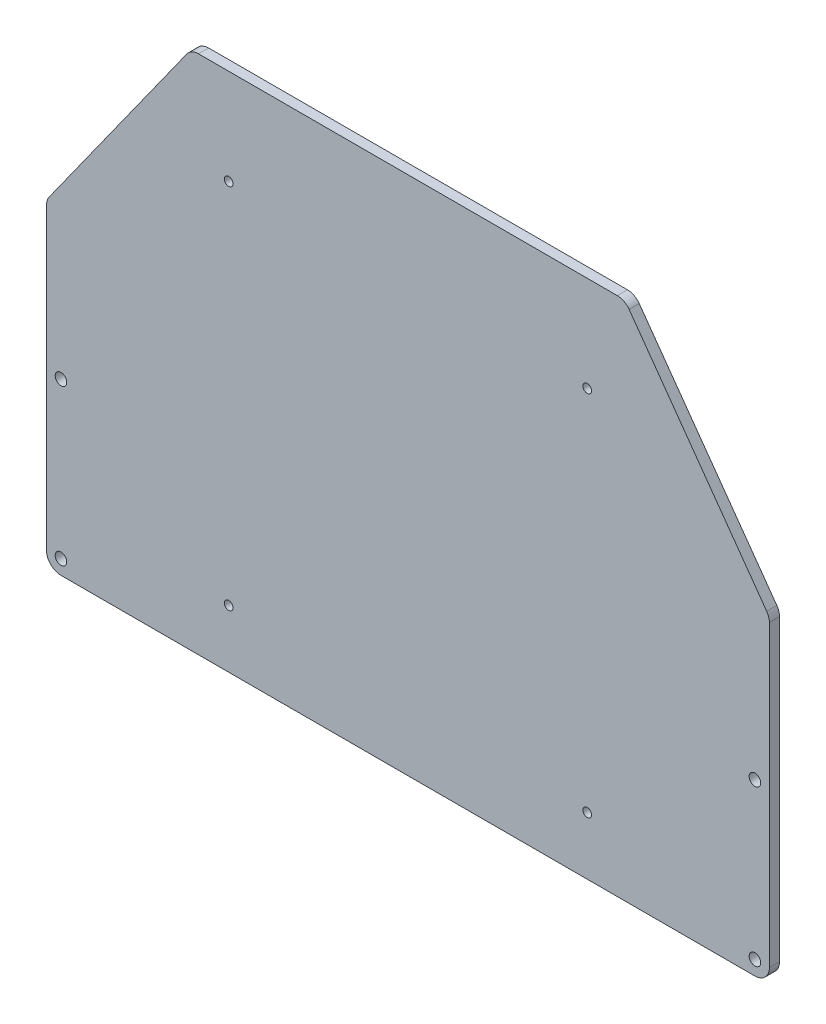
ISO-10303-21;
HEADER;
FILE_DESCRIPTION(('STEP AP214'),'2;1');
FILE_NAME('part.step','',(''),(''),'','','');
FILE_SCHEMA(('AUTOMOTIVE_DESIGN { 1 0 10303 214 1 1 1 1 }'));
ENDSEC;
DATA;
#1=APPLICATION_CONTEXT('core data for automotive mechanical design processes');
#2=APPLICATION_PROTOCOL_DEFINITION('international standard','automotive_design',2000,#1);
#3=PRODUCT_CONTEXT('',#1,'mechanical');
#4=PRODUCT('Part','Part','',(#3));
#5=PRODUCT_RELATED_PRODUCT_CATEGORY('part','',(#4));
#6=PRODUCT_DEFINITION_FORMATION('','',#4);
#7=PRODUCT_DEFINITION_CONTEXT('part definition',#1,'design');
#8=PRODUCT_DEFINITION('design','',#6,#7);
#9=PRODUCT_DEFINITION_SHAPE('','',#8);
#10=(LENGTH_UNIT() NAMED_UNIT(*) SI_UNIT(.MILLI.,.METRE.));
#11=(NAMED_UNIT(*) PLANE_ANGLE_UNIT() SI_UNIT($,.RADIAN.));
#12=(NAMED_UNIT(*) SI_UNIT($,.STERADIAN.) SOLID_ANGLE_UNIT());
#13=UNCERTAINTY_MEASURE_WITH_UNIT(LENGTH_MEASURE(1.E-05),#10,'distance_accuracy_value','');
#14=(GEOMETRIC_REPRESENTATION_CONTEXT(3) GLOBAL_UNCERTAINTY_ASSIGNED_CONTEXT((#13)) GLOBAL_UNIT_ASSIGNED_CONTEXT((#10,
#11,#12)) REPRESENTATION_CONTEXT('',''));
#15=CARTESIAN_POINT('',(0.,0.,0.));
#16=DIRECTION('',(0.,0.,1.));
#17=DIRECTION('',(1.,0.,0.));
#18=AXIS2_PLACEMENT_3D('',#15,#16,#17);
#19=CARTESIAN_POINT('',(250.,5.,3.5));
#20=DIRECTION('',(-1.,0.,0.));
#21=DIRECTION('',(0.,0.,1.));
#22=AXIS2_PLACEMENT_3D('',#19,#20,#21);
#23=PLANE('',#22);
#24=DIRECTION('',(0.,1.,0.));
#25=VECTOR('',#24,1.);
#26=CARTESIAN_POINT('',(250.,5.,0.));
#27=LINE('',#26,#25);
#28=CARTESIAN_POINT('',(250.,5.,0.));
#29=VERTEX_POINT('',#28);
#30=CARTESIAN_POINT('',(250.,108.397674732957,0.));
#31=VERTEX_POINT('',#30);
#32=EDGE_CURVE('E223',#29,#31,#27,.T.);
#33=ORIENTED_EDGE('',*,*,#32,.T.);
#34=DIRECTION('',(0.,0.,-1.));
#35=VECTOR('',#34,1.);
#36=CARTESIAN_POINT('',(250.,108.397674732957,3.5));
#37=LINE('',#36,#35);
#38=CARTESIAN_POINT('',(250.,108.397674732957,3.5));
#39=VERTEX_POINT('',#38);
#40=EDGE_CURVE('E177',#31,#39,#37,.F.);
#41=ORIENTED_EDGE('',*,*,#40,.T.);
#42=DIRECTION('',(0.,1.,0.));
#43=VECTOR('',#42,1.);
#44=CARTESIAN_POINT('',(250.,5.,3.5));
#45=LINE('',#44,#43);
#46=CARTESIAN_POINT('',(250.,5.,3.5));
#47=VERTEX_POINT('',#46);
#48=EDGE_CURVE('E211',#47,#39,#45,.T.);
#49=ORIENTED_EDGE('',*,*,#48,.F.);
#50=DIRECTION('',(0.,0.,-1.));
#51=VECTOR('',#50,1.);
#52=CARTESIAN_POINT('',(250.,5.,3.5));
#53=LINE('',#52,#51);
#54=EDGE_CURVE('E155',#47,#29,#53,.T.);
#55=ORIENTED_EDGE('',*,*,#54,.T.);
#56=EDGE_LOOP('',(#33,#41,#49,#55));
#57=FACE_BOUND('',#56,.T.);
#58=ADVANCED_FACE('F34',(#57),#23,.F.);
#59=CARTESIAN_POINT('',(0.,5.00000000000004,3.5));
#60=DIRECTION('',(1.,0.,0.));
#61=DIRECTION('',(0.,0.,-1.));
#62=AXIS2_PLACEMENT_3D('',#59,#60,#61);
#63=PLANE('',#62);
#64=DIRECTION('',(0.,-1.,0.));
#65=VECTOR('',#64,1.);
#66=CARTESIAN_POINT('',(0.,5.00000000000004,3.5));
#67=LINE('',#66,#65);
#68=CARTESIAN_POINT('',(0.,108.397674732957,3.5));
#69=VERTEX_POINT('',#68);
#70=CARTESIAN_POINT('',(0.,5.00000000000004,3.5));
#71=VERTEX_POINT('',#70);
#72=EDGE_CURVE('E141',#69,#71,#67,.T.);
#73=ORIENTED_EDGE('',*,*,#72,.F.);
#74=DIRECTION('',(0.,0.,-1.));
#75=VECTOR('',#74,1.);
#76=CARTESIAN_POINT('',(0.,108.397674732957,0.));
#77=LINE('',#76,#75);
#78=CARTESIAN_POINT('',(0.,108.397674732957,0.));
#79=VERTEX_POINT('',#78);
#80=EDGE_CURVE('E11',#69,#79,#77,.T.);
#81=ORIENTED_EDGE('',*,*,#80,.T.);
#82=DIRECTION('',(0.,-1.,0.));
#83=VECTOR('',#82,1.);
#84=CARTESIAN_POINT('',(0.,5.00000000000004,0.));
#85=LINE('',#84,#83);
#86=CARTESIAN_POINT('',(0.,5.00000000000004,0.));
#87=VERTEX_POINT('',#86);
#88=EDGE_CURVE('E145',#79,#87,#85,.T.);
#89=ORIENTED_EDGE('',*,*,#88,.T.);
#90=DIRECTION('',(0.,0.,-1.));
#91=VECTOR('',#90,1.);
#92=CARTESIAN_POINT('',(0.,5.00000000000004,3.5));
#93=LINE('',#92,#91);
#94=EDGE_CURVE('E210',#71,#87,#93,.T.);
#95=ORIENTED_EDGE('',*,*,#94,.F.);
#96=EDGE_LOOP('',(#73,#81,#89,#95));
#97=FACE_BOUND('',#96,.T.);
#98=ADVANCED_FACE('F209',(#97),#63,.F.);
#99=CARTESIAN_POINT('',(5.,5.,3.5));
#100=DIRECTION('',(0.,0.,-1.));
#101=DIRECTION('',(-1.,0.,0.));
#102=AXIS2_PLACEMENT_3D('',#99,#100,#101);
#103=PLANE('',#102);
#104=CARTESIAN_POINT('',(187.,147.,3.5));
#105=DIRECTION('',(0.,0.,-1.));
#106=DIRECTION('',(-1.,0.,0.));
#107=AXIS2_PLACEMENT_3D('',#104,#105,#106);
#108=CIRCLE('',#107,1.5);
#109=CARTESIAN_POINT('',(185.5,147.,3.5));
#110=VERTEX_POINT('',#109);
#111=EDGE_CURVE('E339',#110,#110,#108,.T.);
#112=ORIENTED_EDGE('',*,*,#111,.T.);
#113=EDGE_LOOP('',(#112));
#114=FACE_BOUND('',#113,.T.);
#115=CARTESIAN_POINT('',(63.,147.,3.5));
#116=DIRECTION('',(0.,0.,-1.));
#117=DIRECTION('',(-1.,0.,0.));
#118=AXIS2_PLACEMENT_3D('',#115,#116,#117);
#119=CIRCLE('',#118,1.5);
#120=CARTESIAN_POINT('',(61.5,147.,3.5));
#121=VERTEX_POINT('',#120);
#122=EDGE_CURVE('E343',#121,#121,#119,.T.);
#123=ORIENTED_EDGE('',*,*,#122,.T.);
#124=EDGE_LOOP('',(#123));
#125=FACE_BOUND('',#124,.T.);
#126=CARTESIAN_POINT('',(63.,20.,3.5));
#127=DIRECTION('',(0.,0.,-1.));
#128=DIRECTION('',(-1.,0.,0.));
#129=AXIS2_PLACEMENT_3D('',#126,#127,#128);
#130=CIRCLE('',#129,1.5);
#131=CARTESIAN_POINT('',(61.5,20.,3.5));
#132=VERTEX_POINT('',#131);
#133=EDGE_CURVE('E352',#132,#132,#130,.T.);
#134=ORIENTED_EDGE('',*,*,#133,.T.);
#135=EDGE_LOOP('',(#134));
#136=FACE_BOUND('',#135,.T.);
#137=CARTESIAN_POINT('',(187.,20.,3.5));
#138=DIRECTION('',(0.,0.,-1.));
#139=DIRECTION('',(-1.,0.,0.));
#140=AXIS2_PLACEMENT_3D('',#137,#138,#139);
#141=CIRCLE('',#140,1.5);
#142=CARTESIAN_POINT('',(185.5,20.,3.5));
#143=VERTEX_POINT('',#142);
#144=EDGE_CURVE('E245',#143,#143,#141,.T.);
#145=ORIENTED_EDGE('',*,*,#144,.T.);
#146=EDGE_LOOP('',(#145));
#147=FACE_BOUND('',#146,.T.);
#148=CARTESIAN_POINT('',(5.,5.,3.5));
#149=DIRECTION('',(0.,0.,1.));
#150=DIRECTION('',(1.,0.,0.));
#151=AXIS2_PLACEMENT_3D('',#148,#149,#150);
#152=CIRCLE('',#151,2.);
#153=CARTESIAN_POINT('',(7.,5.,3.5));
#154=VERTEX_POINT('',#153);
#155=EDGE_CURVE('E258',#154,#154,#152,.T.);
#156=ORIENTED_EDGE('',*,*,#155,.F.);
#157=EDGE_LOOP('',(#156));
#158=FACE_BOUND('',#157,.T.);
#159=CARTESIAN_POINT('',(245.,58.8,3.5));
#160=DIRECTION('',(0.,0.,1.));
#161=DIRECTION('',(1.,0.,0.));
#162=AXIS2_PLACEMENT_3D('',#159,#160,#161);
#163=CIRCLE('',#162,2.);
#164=CARTESIAN_POINT('',(247.,58.8,3.5));
#165=VERTEX_POINT('',#164);
#166=EDGE_CURVE('E254',#165,#165,#163,.T.);
#167=ORIENTED_EDGE('',*,*,#166,.F.);
#168=EDGE_LOOP('',(#167));
#169=FACE_BOUND('',#168,.T.);
#170=CARTESIAN_POINT('',(5.,58.8,3.5));
#171=DIRECTION('',(0.,0.,1.));
#172=DIRECTION('',(1.,0.,0.));
#173=AXIS2_PLACEMENT_3D('',#170,#171,#172);
#174=CIRCLE('',#173,2.);
#175=CARTESIAN_POINT('',(7.,58.8,3.5));
#176=VERTEX_POINT('',#175);
#177=EDGE_CURVE('E265',#176,#176,#174,.T.);
#178=ORIENTED_EDGE('',*,*,#177,.F.);
#179=EDGE_LOOP('',(#178));
#180=FACE_BOUND('',#179,.T.);
#181=CARTESIAN_POINT('',(245.,5.,3.5));
#182=DIRECTION('',(0.,0.,1.));
#183=DIRECTION('',(1.,0.,0.));
#184=AXIS2_PLACEMENT_3D('',#181,#182,#183);
#185=CIRCLE('',#184,2.);
#186=CARTESIAN_POINT('',(247.,5.,3.5));
#187=VERTEX_POINT('',#186);
#188=EDGE_CURVE('E259',#187,#187,#185,.T.);
#189=ORIENTED_EDGE('',*,*,#188,.F.);
#190=EDGE_LOOP('',(#189));
#191=FACE_BOUND('',#190,.T.);
#192=ORIENTED_EDGE('',*,*,#48,.T.);
#193=CARTESIAN_POINT('',(245.,108.397674732957,3.5));
#194=DIRECTION('',(0.,0.,-1.));
#195=DIRECTION('',(-1.,0.,0.));
#196=AXIS2_PLACEMENT_3D('',#193,#194,#195);
#197=CIRCLE('',#196,5.);
#198=CARTESIAN_POINT('',(249.068667356034,111.303865701553,3.5));
#199=VERTEX_POINT('',#198);
#200=EDGE_CURVE('E184',#39,#199,#197,.F.);
#201=ORIENTED_EDGE('',*,*,#200,.T.);
#202=DIRECTION('',(0.581238193719096,-0.813733471206735,0.));
#203=VECTOR('',#202,1.);
#204=CARTESIAN_POINT('',(216.891891891892,156.351351351351,3.5));
#205=LINE('',#204,#203);
#206=CARTESIAN_POINT('',(201.495577879575,177.906190968595,3.5));
#207=VERTEX_POINT('',#206);
#208=EDGE_CURVE('E243',#207,#199,#205,.T.);
#209=ORIENTED_EDGE('',*,*,#208,.F.);
#210=CARTESIAN_POINT('',(197.426910523541,175.,3.5));
#211=DIRECTION('',(0.,0.,-1.));
#212=DIRECTION('',(-1.,0.,0.));
#213=AXIS2_PLACEMENT_3D('',#210,#211,#212);
#214=CIRCLE('',#213,5.);
#215=CARTESIAN_POINT('',(197.426910523541,180.,3.5));
#216=VERTEX_POINT('',#215);
#217=EDGE_CURVE('E49',#207,#216,#214,.F.);
#218=ORIENTED_EDGE('',*,*,#217,.T.);
#219=DIRECTION('',(1.,0.,0.));
#220=VECTOR('',#219,1.);
#221=CARTESIAN_POINT('',(5.,180.,3.5));
#222=LINE('',#221,#220);
#223=CARTESIAN_POINT('',(52.573089476459,180.,3.5));
#224=VERTEX_POINT('',#223);
#225=EDGE_CURVE('E244',#224,#216,#222,.T.);
#226=ORIENTED_EDGE('',*,*,#225,.F.);
#227=CARTESIAN_POINT('',(52.573089476459,175.,3.5));
#228=DIRECTION('',(0.,0.,-1.));
#229=DIRECTION('',(-1.,0.,0.));
#230=AXIS2_PLACEMENT_3D('',#227,#228,#229);
#231=CIRCLE('',#230,5.);
#232=CARTESIAN_POINT('',(48.5044221204253,177.906190968595,3.5));
#233=VERTEX_POINT('',#232);
#234=EDGE_CURVE('E181',#224,#233,#231,.F.);
#235=ORIENTED_EDGE('',*,*,#234,.T.);
#236=DIRECTION('',(0.581238193719096,0.813733471206735,0.));
#237=VECTOR('',#236,1.);
#238=CARTESIAN_POINT('',(-47.972972972973,42.8378378378378,3.5));
#239=LINE('',#238,#237);
#240=CARTESIAN_POINT('',(0.931332643966325,111.303865701553,3.5));
#241=VERTEX_POINT('',#240);
#242=EDGE_CURVE('E199',#241,#233,#239,.T.);
#243=ORIENTED_EDGE('',*,*,#242,.F.);
#244=CARTESIAN_POINT('',(5.,108.397674732957,3.5));
#245=DIRECTION('',(0.,0.,-1.));
#246=DIRECTION('',(-1.,0.,0.));
#247=AXIS2_PLACEMENT_3D('',#244,#245,#246);
#248=CIRCLE('',#247,5.);
#249=EDGE_CURVE('E179',#241,#69,#248,.F.);
#250=ORIENTED_EDGE('',*,*,#249,.T.);
#251=ORIENTED_EDGE('',*,*,#72,.T.);
#252=CARTESIAN_POINT('',(5.,5.,3.5));
#253=DIRECTION('',(0.,0.,1.));
#254=DIRECTION('',(-1.,0.,0.));
#255=AXIS2_PLACEMENT_3D('',#252,#253,#254);
#256=CIRCLE('',#255,5.);
#257=CARTESIAN_POINT('',(5.00000000000004,0.,3.5));
#258=VERTEX_POINT('',#257);
#259=EDGE_CURVE('E135',#71,#258,#256,.T.);
#260=ORIENTED_EDGE('',*,*,#259,.T.);
#261=DIRECTION('',(1.,0.,0.));
#262=VECTOR('',#261,1.);
#263=CARTESIAN_POINT('',(5.00000000000004,0.,3.5));
#264=LINE('',#263,#262);
#265=CARTESIAN_POINT('',(245.,0.,3.5));
#266=VERTEX_POINT('',#265);
#267=EDGE_CURVE('E125',#258,#266,#264,.T.);
#268=ORIENTED_EDGE('',*,*,#267,.T.);
#269=CARTESIAN_POINT('',(245.,5.,3.5));
#270=DIRECTION('',(0.,0.,1.));
#271=DIRECTION('',(-1.,0.,0.));
#272=AXIS2_PLACEMENT_3D('',#269,#270,#271);
#273=CIRCLE('',#272,5.);
#274=EDGE_CURVE('E134',#266,#47,#273,.T.);
#275=ORIENTED_EDGE('',*,*,#274,.T.);
#276=EDGE_LOOP('',(#192,#201,#209,#218,#226,#235,#243,#250,#251,#260,#268,#275));
#277=FACE_BOUND('',#276,.T.);
#278=ADVANCED_FACE('F139',(#114,#125,#136,#147,#158,#169,#180,#191,#277),#103,.F.);
#279=CARTESIAN_POINT('',(5.,5.,0.));
#280=DIRECTION('',(0.,0.,-1.));
#281=DIRECTION('',(-1.,0.,0.));
#282=AXIS2_PLACEMENT_3D('',#279,#280,#281);
#283=PLANE('',#282);
#284=CARTESIAN_POINT('',(187.,147.,0.));
#285=DIRECTION('',(0.,0.,-1.));
#286=DIRECTION('',(-1.,0.,0.));
#287=AXIS2_PLACEMENT_3D('',#284,#285,#286);
#288=CIRCLE('',#287,1.5);
#289=CARTESIAN_POINT('',(185.5,147.,0.));
#290=VERTEX_POINT('',#289);
#291=EDGE_CURVE('E342',#290,#290,#288,.T.);
#292=ORIENTED_EDGE('',*,*,#291,.F.);
#293=EDGE_LOOP('',(#292));
#294=FACE_BOUND('',#293,.T.);
#295=CARTESIAN_POINT('',(63.,147.,0.));
#296=DIRECTION('',(0.,0.,-1.));
#297=DIRECTION('',(-1.,0.,0.));
#298=AXIS2_PLACEMENT_3D('',#295,#296,#297);
#299=CIRCLE('',#298,1.5);
#300=CARTESIAN_POINT('',(61.5,147.,0.));
#301=VERTEX_POINT('',#300);
#302=EDGE_CURVE('E347',#301,#301,#299,.T.);
#303=ORIENTED_EDGE('',*,*,#302,.F.);
#304=EDGE_LOOP('',(#303));
#305=FACE_BOUND('',#304,.T.);
#306=CARTESIAN_POINT('',(63.,20.,0.));
#307=DIRECTION('',(0.,0.,-1.));
#308=DIRECTION('',(-1.,0.,0.));
#309=AXIS2_PLACEMENT_3D('',#306,#307,#308);
#310=CIRCLE('',#309,1.5);
#311=CARTESIAN_POINT('',(61.5,20.,0.));
#312=VERTEX_POINT('',#311);
#313=EDGE_CURVE('E355',#312,#312,#310,.T.);
#314=ORIENTED_EDGE('',*,*,#313,.F.);
#315=EDGE_LOOP('',(#314));
#316=FACE_BOUND('',#315,.T.);
#317=CARTESIAN_POINT('',(187.,20.,0.));
#318=DIRECTION('',(0.,0.,-1.));
#319=DIRECTION('',(-1.,0.,0.));
#320=AXIS2_PLACEMENT_3D('',#317,#318,#319);
#321=CIRCLE('',#320,1.5);
#322=CARTESIAN_POINT('',(185.5,20.,0.));
#323=VERTEX_POINT('',#322);
#324=EDGE_CURVE('E249',#323,#323,#321,.T.);
#325=ORIENTED_EDGE('',*,*,#324,.F.);
#326=EDGE_LOOP('',(#325));
#327=FACE_BOUND('',#326,.T.);
#328=CARTESIAN_POINT('',(245.,5.,0.));
#329=DIRECTION('',(0.,0.,1.));
#330=DIRECTION('',(1.,0.,0.));
#331=AXIS2_PLACEMENT_3D('',#328,#329,#330);
#332=CIRCLE('',#331,2.);
#333=CARTESIAN_POINT('',(247.,5.,0.));
#334=VERTEX_POINT('',#333);
#335=EDGE_CURVE('E255',#334,#334,#332,.T.);
#336=ORIENTED_EDGE('',*,*,#335,.T.);
#337=EDGE_LOOP('',(#336));
#338=FACE_BOUND('',#337,.T.);
#339=CARTESIAN_POINT('',(5.,58.8,0.));
#340=DIRECTION('',(0.,0.,1.));
#341=DIRECTION('',(1.,0.,0.));
#342=AXIS2_PLACEMENT_3D('',#339,#340,#341);
#343=CIRCLE('',#342,2.);
#344=CARTESIAN_POINT('',(7.,58.8,0.));
#345=VERTEX_POINT('',#344);
#346=EDGE_CURVE('E262',#345,#345,#343,.T.);
#347=ORIENTED_EDGE('',*,*,#346,.T.);
#348=EDGE_LOOP('',(#347));
#349=FACE_BOUND('',#348,.T.);
#350=CARTESIAN_POINT('',(245.,58.8,0.));
#351=DIRECTION('',(0.,0.,1.));
#352=DIRECTION('',(1.,0.,0.));
#353=AXIS2_PLACEMENT_3D('',#350,#351,#352);
#354=CIRCLE('',#353,2.);
#355=CARTESIAN_POINT('',(247.,58.8,0.));
#356=VERTEX_POINT('',#355);
#357=EDGE_CURVE('E268',#356,#356,#354,.T.);
#358=ORIENTED_EDGE('',*,*,#357,.T.);
#359=EDGE_LOOP('',(#358));
#360=FACE_BOUND('',#359,.T.);
#361=CARTESIAN_POINT('',(5.,5.,0.));
#362=DIRECTION('',(0.,0.,1.));
#363=DIRECTION('',(1.,0.,0.));
#364=AXIS2_PLACEMENT_3D('',#361,#362,#363);
#365=CIRCLE('',#364,2.);
#366=CARTESIAN_POINT('',(7.,5.,0.));
#367=VERTEX_POINT('',#366);
#368=EDGE_CURVE('E219',#367,#367,#365,.T.);
#369=ORIENTED_EDGE('',*,*,#368,.T.);
#370=EDGE_LOOP('',(#369));
#371=FACE_BOUND('',#370,.T.);
#372=DIRECTION('',(0.581238193719096,-0.813733471206735,0.));
#373=VECTOR('',#372,1.);
#374=CARTESIAN_POINT('',(216.891891891892,156.351351351351,0.));
#375=LINE('',#374,#373);
#376=CARTESIAN_POINT('',(201.495577879575,177.906190968595,0.));
#377=VERTEX_POINT('',#376);
#378=CARTESIAN_POINT('',(249.068667356034,111.303865701553,0.));
#379=VERTEX_POINT('',#378);
#380=EDGE_CURVE('E150',#377,#379,#375,.T.);
#381=ORIENTED_EDGE('',*,*,#380,.T.);
#382=CARTESIAN_POINT('',(245.,108.397674732957,0.));
#383=DIRECTION('',(0.,0.,-1.));
#384=DIRECTION('',(-1.,0.,0.));
#385=AXIS2_PLACEMENT_3D('',#382,#383,#384);
#386=CIRCLE('',#385,5.);
#387=EDGE_CURVE('E175',#379,#31,#386,.T.);
#388=ORIENTED_EDGE('',*,*,#387,.T.);
#389=ORIENTED_EDGE('',*,*,#32,.F.);
#390=CARTESIAN_POINT('',(245.,5.,0.));
#391=DIRECTION('',(0.,0.,1.));
#392=DIRECTION('',(-1.,0.,0.));
#393=AXIS2_PLACEMENT_3D('',#390,#391,#392);
#394=CIRCLE('',#393,5.);
#395=CARTESIAN_POINT('',(245.,0.,0.));
#396=VERTEX_POINT('',#395);
#397=EDGE_CURVE('E221',#396,#29,#394,.T.);
#398=ORIENTED_EDGE('',*,*,#397,.F.);
#399=DIRECTION('',(1.,0.,0.));
#400=VECTOR('',#399,1.);
#401=CARTESIAN_POINT('',(5.00000000000004,0.,0.));
#402=LINE('',#401,#400);
#403=CARTESIAN_POINT('',(5.00000000000004,0.,0.));
#404=VERTEX_POINT('',#403);
#405=EDGE_CURVE('E218',#404,#396,#402,.T.);
#406=ORIENTED_EDGE('',*,*,#405,.F.);
#407=CARTESIAN_POINT('',(5.,5.,0.));
#408=DIRECTION('',(0.,0.,1.));
#409=DIRECTION('',(-1.,0.,0.));
#410=AXIS2_PLACEMENT_3D('',#407,#408,#409);
#411=CIRCLE('',#410,5.);
#412=EDGE_CURVE('E149',#87,#404,#411,.T.);
#413=ORIENTED_EDGE('',*,*,#412,.F.);
#414=ORIENTED_EDGE('',*,*,#88,.F.);
#415=CARTESIAN_POINT('',(5.,108.397674732957,0.));
#416=DIRECTION('',(0.,0.,-1.));
#417=DIRECTION('',(-1.,0.,0.));
#418=AXIS2_PLACEMENT_3D('',#415,#416,#417);
#419=CIRCLE('',#418,5.);
#420=CARTESIAN_POINT('',(0.931332643966325,111.303865701553,0.));
#421=VERTEX_POINT('',#420);
#422=EDGE_CURVE('E169',#79,#421,#419,.T.);
#423=ORIENTED_EDGE('',*,*,#422,.T.);
#424=DIRECTION('',(0.581238193719096,0.813733471206735,0.));
#425=VECTOR('',#424,1.);
#426=CARTESIAN_POINT('',(-47.972972972973,42.8378378378378,0.));
#427=LINE('',#426,#425);
#428=CARTESIAN_POINT('',(48.5044221204253,177.906190968595,0.));
#429=VERTEX_POINT('',#428);
#430=EDGE_CURVE('E161',#421,#429,#427,.T.);
#431=ORIENTED_EDGE('',*,*,#430,.T.);
#432=CARTESIAN_POINT('',(52.573089476459,175.,0.));
#433=DIRECTION('',(0.,0.,-1.));
#434=DIRECTION('',(-1.,0.,0.));
#435=AXIS2_PLACEMENT_3D('',#432,#433,#434);
#436=CIRCLE('',#435,5.);
#437=CARTESIAN_POINT('',(52.573089476459,180.,0.));
#438=VERTEX_POINT('',#437);
#439=EDGE_CURVE('E171',#429,#438,#436,.T.);
#440=ORIENTED_EDGE('',*,*,#439,.T.);
#441=DIRECTION('',(1.,0.,0.));
#442=VECTOR('',#441,1.);
#443=CARTESIAN_POINT('',(5.,180.,0.));
#444=LINE('',#443,#442);
#445=CARTESIAN_POINT('',(197.426910523541,180.,0.));
#446=VERTEX_POINT('',#445);
#447=EDGE_CURVE('E153',#438,#446,#444,.T.);
#448=ORIENTED_EDGE('',*,*,#447,.T.);
#449=CARTESIAN_POINT('',(197.426910523541,175.,0.));
#450=DIRECTION('',(0.,0.,-1.));
#451=DIRECTION('',(-1.,0.,0.));
#452=AXIS2_PLACEMENT_3D('',#449,#450,#451);
#453=CIRCLE('',#452,5.);
#454=EDGE_CURVE('E173',#446,#377,#453,.T.);
#455=ORIENTED_EDGE('',*,*,#454,.T.);
#456=EDGE_LOOP('',(#381,#388,#389,#398,#406,#413,#414,#423,#431,#440,#448,#455));
#457=FACE_BOUND('',#456,.T.);
#458=ADVANCED_FACE('F203',(#294,#305,#316,#327,#338,#349,#360,#371,#457),#283,.T.);
#459=CARTESIAN_POINT('',(5.,5.,3.5));
#460=DIRECTION('',(0.,0.,-1.));
#461=DIRECTION('',(-1.,0.,0.));
#462=AXIS2_PLACEMENT_3D('',#459,#460,#461);
#463=CYLINDRICAL_SURFACE('',#462,5.);
#464=ORIENTED_EDGE('',*,*,#412,.T.);
#465=DIRECTION('',(0.,0.,-1.));
#466=VECTOR('',#465,1.);
#467=CARTESIAN_POINT('',(5.00000000000004,0.,3.5));
#468=LINE('',#467,#466);
#469=EDGE_CURVE('E129',#258,#404,#468,.T.);
#470=ORIENTED_EDGE('',*,*,#469,.F.);
#471=ORIENTED_EDGE('',*,*,#259,.F.);
#472=ORIENTED_EDGE('',*,*,#94,.T.);
#473=EDGE_LOOP('',(#464,#470,#471,#472));
#474=FACE_BOUND('',#473,.T.);
#475=ADVANCED_FACE('F147',(#474),#463,.T.);
#476=CARTESIAN_POINT('',(5.00000000000004,0.,3.5));
#477=DIRECTION('',(0.,1.,0.));
#478=DIRECTION('',(0.,0.,1.));
#479=AXIS2_PLACEMENT_3D('',#476,#477,#478);
#480=PLANE('',#479);
#481=ORIENTED_EDGE('',*,*,#405,.T.);
#482=DIRECTION('',(0.,0.,-1.));
#483=VECTOR('',#482,1.);
#484=CARTESIAN_POINT('',(245.,0.,3.5));
#485=LINE('',#484,#483);
#486=EDGE_CURVE('E132',#266,#396,#485,.T.);
#487=ORIENTED_EDGE('',*,*,#486,.F.);
#488=ORIENTED_EDGE('',*,*,#267,.F.);
#489=ORIENTED_EDGE('',*,*,#469,.T.);
#490=EDGE_LOOP('',(#481,#487,#488,#489));
#491=FACE_BOUND('',#490,.T.);
#492=ADVANCED_FACE('F127',(#491),#480,.F.);
#493=CARTESIAN_POINT('',(245.,5.,3.5));
#494=DIRECTION('',(0.,0.,-1.));
#495=DIRECTION('',(-1.,0.,0.));
#496=AXIS2_PLACEMENT_3D('',#493,#494,#495);
#497=CYLINDRICAL_SURFACE('',#496,5.);
#498=ORIENTED_EDGE('',*,*,#397,.T.);
#499=ORIENTED_EDGE('',*,*,#54,.F.);
#500=ORIENTED_EDGE('',*,*,#274,.F.);
#501=ORIENTED_EDGE('',*,*,#486,.T.);
#502=EDGE_LOOP('',(#498,#499,#500,#501));
#503=FACE_BOUND('',#502,.T.);
#504=ADVANCED_FACE('F276',(#503),#497,.T.);
#505=CARTESIAN_POINT('',(5.,5.,0.));
#506=DIRECTION('',(0.,0.,1.));
#507=DIRECTION('',(1.,0.,0.));
#508=AXIS2_PLACEMENT_3D('',#505,#506,#507);
#509=CYLINDRICAL_SURFACE('',#508,2.);
#510=ORIENTED_EDGE('',*,*,#368,.F.);
#511=EDGE_LOOP('',(#510));
#512=FACE_BOUND('',#511,.T.);
#513=ORIENTED_EDGE('',*,*,#155,.T.);
#514=EDGE_LOOP('',(#513));
#515=FACE_BOUND('',#514,.T.);
#516=ADVANCED_FACE('F278',(#512,#515),#509,.F.);
#517=CARTESIAN_POINT('',(245.,58.8,0.));
#518=DIRECTION('',(0.,0.,1.));
#519=DIRECTION('',(1.,0.,0.));
#520=AXIS2_PLACEMENT_3D('',#517,#518,#519);
#521=CYLINDRICAL_SURFACE('',#520,2.);
#522=ORIENTED_EDGE('',*,*,#357,.F.);
#523=EDGE_LOOP('',(#522));
#524=FACE_BOUND('',#523,.T.);
#525=ORIENTED_EDGE('',*,*,#166,.T.);
#526=EDGE_LOOP('',(#525));
#527=FACE_BOUND('',#526,.T.);
#528=ADVANCED_FACE('F284',(#524,#527),#521,.F.);
#529=CARTESIAN_POINT('',(5.,58.8,0.));
#530=DIRECTION('',(0.,0.,1.));
#531=DIRECTION('',(1.,0.,0.));
#532=AXIS2_PLACEMENT_3D('',#529,#530,#531);
#533=CYLINDRICAL_SURFACE('',#532,2.);
#534=ORIENTED_EDGE('',*,*,#346,.F.);
#535=EDGE_LOOP('',(#534));
#536=FACE_BOUND('',#535,.T.);
#537=ORIENTED_EDGE('',*,*,#177,.T.);
#538=EDGE_LOOP('',(#537));
#539=FACE_BOUND('',#538,.T.);
#540=ADVANCED_FACE('F303',(#536,#539),#533,.F.);
#541=CARTESIAN_POINT('',(245.,5.,0.));
#542=DIRECTION('',(0.,0.,1.));
#543=DIRECTION('',(1.,0.,0.));
#544=AXIS2_PLACEMENT_3D('',#541,#542,#543);
#545=CYLINDRICAL_SURFACE('',#544,2.);
#546=ORIENTED_EDGE('',*,*,#335,.F.);
#547=EDGE_LOOP('',(#546));
#548=FACE_BOUND('',#547,.T.);
#549=ORIENTED_EDGE('',*,*,#188,.T.);
#550=EDGE_LOOP('',(#549));
#551=FACE_BOUND('',#550,.T.);
#552=ADVANCED_FACE('F307',(#548,#551),#545,.F.);
#553=CARTESIAN_POINT('',(0.,110.,500.852639579119));
#554=DIRECTION('',(-0.813733471206735,0.581238193719096,0.));
#555=DIRECTION('',(-0.581238193719096,-0.813733471206735,0.));
#556=AXIS2_PLACEMENT_3D('',#553,#554,#555);
#557=PLANE('',#556);
#558=ORIENTED_EDGE('',*,*,#242,.T.);
#559=DIRECTION('',(0.,0.,-1.));
#560=VECTOR('',#559,1.);
#561=CARTESIAN_POINT('',(48.5044221204253,177.906190968595,500.852639579119));
#562=LINE('',#561,#560);
#563=EDGE_CURVE('E42',#233,#429,#562,.T.);
#564=ORIENTED_EDGE('',*,*,#563,.T.);
#565=ORIENTED_EDGE('',*,*,#430,.F.);
#566=DIRECTION('',(0.,0.,-1.));
#567=VECTOR('',#566,1.);
#568=CARTESIAN_POINT('',(0.931332643966327,111.303865701553,3.5));
#569=LINE('',#568,#567);
#570=EDGE_CURVE('E190',#421,#241,#569,.F.);
#571=ORIENTED_EDGE('',*,*,#570,.T.);
#572=EDGE_LOOP('',(#558,#564,#565,#571));
#573=FACE_BOUND('',#572,.T.);
#574=ADVANCED_FACE('F196',(#573),#557,.T.);
#575=CARTESIAN_POINT('',(50.,180.,500.852639579119));
#576=DIRECTION('',(0.,1.,0.));
#577=DIRECTION('',(0.,0.,1.));
#578=AXIS2_PLACEMENT_3D('',#575,#576,#577);
#579=PLANE('',#578);
#580=ORIENTED_EDGE('',*,*,#225,.T.);
#581=DIRECTION('',(0.,0.,-1.));
#582=VECTOR('',#581,1.);
#583=CARTESIAN_POINT('',(197.426910523541,180.,500.852639579119));
#584=LINE('',#583,#582);
#585=EDGE_CURVE('E187',#216,#446,#584,.T.);
#586=ORIENTED_EDGE('',*,*,#585,.T.);
#587=ORIENTED_EDGE('',*,*,#447,.F.);
#588=DIRECTION('',(0.,0.,-1.));
#589=VECTOR('',#588,1.);
#590=CARTESIAN_POINT('',(52.573089476459,180.,500.852639579119));
#591=LINE('',#590,#589);
#592=EDGE_CURVE('E56',#438,#224,#591,.F.);
#593=ORIENTED_EDGE('',*,*,#592,.T.);
#594=EDGE_LOOP('',(#580,#586,#587,#593));
#595=FACE_BOUND('',#594,.T.);
#596=ADVANCED_FACE('F314',(#595),#579,.T.);
#597=CARTESIAN_POINT('',(200.,180.,500.852639579119));
#598=DIRECTION('',(0.813733471206735,0.581238193719096,0.));
#599=DIRECTION('',(-0.581238193719096,0.813733471206735,0.));
#600=AXIS2_PLACEMENT_3D('',#597,#598,#599);
#601=PLANE('',#600);
#602=ORIENTED_EDGE('',*,*,#208,.T.);
#603=DIRECTION('',(0.,0.,-1.));
#604=VECTOR('',#603,1.);
#605=CARTESIAN_POINT('',(249.068667356034,111.303865701553,0.));
#606=LINE('',#605,#604);
#607=EDGE_CURVE('E166',#199,#379,#606,.T.);
#608=ORIENTED_EDGE('',*,*,#607,.T.);
#609=ORIENTED_EDGE('',*,*,#380,.F.);
#610=DIRECTION('',(0.,0.,-1.));
#611=VECTOR('',#610,1.);
#612=CARTESIAN_POINT('',(201.495577879575,177.906190968595,500.852639579119));
#613=LINE('',#612,#611);
#614=EDGE_CURVE('E164',#377,#207,#613,.F.);
#615=ORIENTED_EDGE('',*,*,#614,.T.);
#616=EDGE_LOOP('',(#602,#608,#609,#615));
#617=FACE_BOUND('',#616,.T.);
#618=ADVANCED_FACE('F241',(#617),#601,.T.);
#619=CARTESIAN_POINT('',(245.,108.397674732957,500.852639579119));
#620=DIRECTION('',(0.,0.,1.));
#621=DIRECTION('',(1.,0.,0.));
#622=AXIS2_PLACEMENT_3D('',#619,#620,#621);
#623=CYLINDRICAL_SURFACE('',#622,5.);
#624=ORIENTED_EDGE('',*,*,#200,.F.);
#625=ORIENTED_EDGE('',*,*,#40,.F.);
#626=ORIENTED_EDGE('',*,*,#387,.F.);
#627=ORIENTED_EDGE('',*,*,#607,.F.);
#628=EDGE_LOOP('',(#624,#625,#626,#627));
#629=FACE_BOUND('',#628,.T.);
#630=ADVANCED_FACE('F238',(#629),#623,.T.);
#631=CARTESIAN_POINT('',(197.426910523541,175.,500.852639579119));
#632=DIRECTION('',(0.,0.,-1.));
#633=DIRECTION('',(-1.,0.,0.));
#634=AXIS2_PLACEMENT_3D('',#631,#632,#633);
#635=CYLINDRICAL_SURFACE('',#634,5.);
#636=ORIENTED_EDGE('',*,*,#217,.F.);
#637=ORIENTED_EDGE('',*,*,#614,.F.);
#638=ORIENTED_EDGE('',*,*,#454,.F.);
#639=ORIENTED_EDGE('',*,*,#585,.F.);
#640=EDGE_LOOP('',(#636,#637,#638,#639));
#641=FACE_BOUND('',#640,.T.);
#642=ADVANCED_FACE('F417',(#641),#635,.T.);
#643=CARTESIAN_POINT('',(52.573089476459,175.,500.852639579119));
#644=DIRECTION('',(0.,0.,-1.));
#645=DIRECTION('',(-1.,0.,0.));
#646=AXIS2_PLACEMENT_3D('',#643,#644,#645);
#647=CYLINDRICAL_SURFACE('',#646,5.);
#648=ORIENTED_EDGE('',*,*,#234,.F.);
#649=ORIENTED_EDGE('',*,*,#592,.F.);
#650=ORIENTED_EDGE('',*,*,#439,.F.);
#651=ORIENTED_EDGE('',*,*,#563,.F.);
#652=EDGE_LOOP('',(#648,#649,#650,#651));
#653=FACE_BOUND('',#652,.T.);
#654=ADVANCED_FACE('F411',(#653),#647,.T.);
#655=CARTESIAN_POINT('',(5.,108.397674732957,3.5));
#656=DIRECTION('',(0.,0.,1.));
#657=DIRECTION('',(1.,0.,0.));
#658=AXIS2_PLACEMENT_3D('',#655,#656,#657);
#659=CYLINDRICAL_SURFACE('',#658,5.);
#660=ORIENTED_EDGE('',*,*,#249,.F.);
#661=ORIENTED_EDGE('',*,*,#570,.F.);
#662=ORIENTED_EDGE('',*,*,#422,.F.);
#663=ORIENTED_EDGE('',*,*,#80,.F.);
#664=EDGE_LOOP('',(#660,#661,#662,#663));
#665=FACE_BOUND('',#664,.T.);
#666=ADVANCED_FACE('F36',(#665),#659,.T.);
#667=CARTESIAN_POINT('',(187.,20.,3.5));
#668=DIRECTION('',(0.,0.,-1.));
#669=DIRECTION('',(-1.,0.,0.));
#670=AXIS2_PLACEMENT_3D('',#667,#668,#669);
#671=CYLINDRICAL_SURFACE('',#670,1.5);
#672=ORIENTED_EDGE('',*,*,#144,.F.);
#673=EDGE_LOOP('',(#672));
#674=FACE_BOUND('',#673,.T.);
#675=ORIENTED_EDGE('',*,*,#324,.T.);
#676=EDGE_LOOP('',(#675));
#677=FACE_BOUND('',#676,.T.);
#678=ADVANCED_FACE('F319',(#674,#677),#671,.F.);
#679=CARTESIAN_POINT('',(63.,20.,3.5));
#680=DIRECTION('',(0.,0.,-1.));
#681=DIRECTION('',(-1.,0.,0.));
#682=AXIS2_PLACEMENT_3D('',#679,#680,#681);
#683=CYLINDRICAL_SURFACE('',#682,1.5);
#684=ORIENTED_EDGE('',*,*,#133,.F.);
#685=EDGE_LOOP('',(#684));
#686=FACE_BOUND('',#685,.T.);
#687=ORIENTED_EDGE('',*,*,#313,.T.);
#688=EDGE_LOOP('',(#687));
#689=FACE_BOUND('',#688,.T.);
#690=ADVANCED_FACE('F322',(#686,#689),#683,.F.);
#691=CARTESIAN_POINT('',(63.,147.,3.5));
#692=DIRECTION('',(0.,0.,-1.));
#693=DIRECTION('',(-1.,0.,0.));
#694=AXIS2_PLACEMENT_3D('',#691,#692,#693);
#695=CYLINDRICAL_SURFACE('',#694,1.5);
#696=ORIENTED_EDGE('',*,*,#122,.F.);
#697=EDGE_LOOP('',(#696));
#698=FACE_BOUND('',#697,.T.);
#699=ORIENTED_EDGE('',*,*,#302,.T.);
#700=EDGE_LOOP('',(#699));
#701=FACE_BOUND('',#700,.T.);
#702=ADVANCED_FACE('F326',(#698,#701),#695,.F.);
#703=CARTESIAN_POINT('',(187.,147.,3.5));
#704=DIRECTION('',(0.,0.,-1.));
#705=DIRECTION('',(-1.,0.,0.));
#706=AXIS2_PLACEMENT_3D('',#703,#704,#705);
#707=CYLINDRICAL_SURFACE('',#706,1.5);
#708=ORIENTED_EDGE('',*,*,#111,.F.);
#709=EDGE_LOOP('',(#708));
#710=FACE_BOUND('',#709,.T.);
#711=ORIENTED_EDGE('',*,*,#291,.T.);
#712=EDGE_LOOP('',(#711));
#713=FACE_BOUND('',#712,.T.);
#714=ADVANCED_FACE('F330',(#710,#713),#707,.F.);
#715=CLOSED_SHELL('',(#58,#98,#278,#458,#475,#492,#504,#516,#528,#540,#552,#574,#596,#618,#630,
#642,#654,#666,#678,#690,#702,#714));
#716=MANIFOLD_SOLID_BREP('B2',#715);
#717=ADVANCED_BREP_SHAPE_REPRESENTATION('',(#18,#716),#14);
#718=SHAPE_DEFINITION_REPRESENTATION(#9,#717);
ENDSEC;
END-ISO-10303-21;
